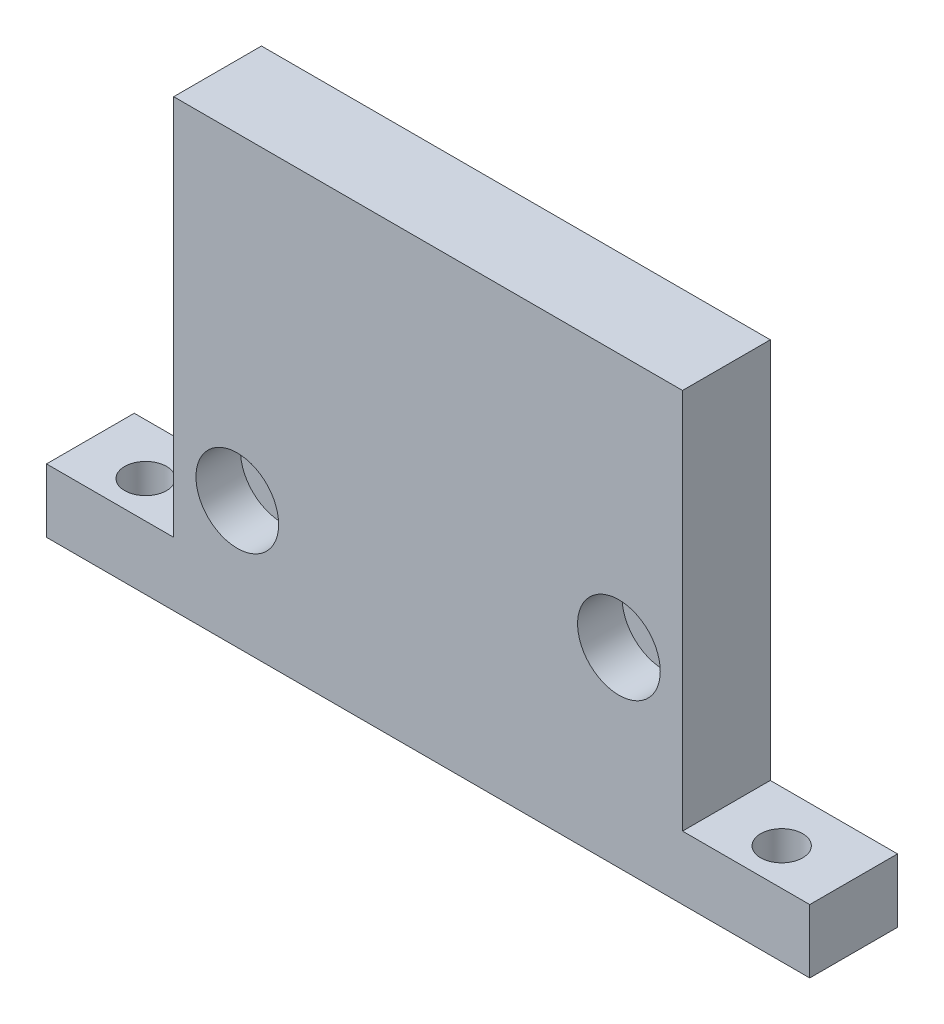
ISO-10303-21;
HEADER;
FILE_DESCRIPTION(('STEP AP214'),'2;1');
FILE_NAME('part.step','',(''),(''),'','','');
FILE_SCHEMA(('AUTOMOTIVE_DESIGN { 1 0 10303 214 1 1 1 1 }'));
ENDSEC;
DATA;
#1=APPLICATION_CONTEXT('core data for automotive mechanical design processes');
#2=APPLICATION_PROTOCOL_DEFINITION('international standard','automotive_design',2000,#1);
#3=PRODUCT_CONTEXT('',#1,'mechanical');
#4=PRODUCT('Part','Part','',(#3));
#5=PRODUCT_RELATED_PRODUCT_CATEGORY('part','',(#4));
#6=PRODUCT_DEFINITION_FORMATION('','',#4);
#7=PRODUCT_DEFINITION_CONTEXT('part definition',#1,'design');
#8=PRODUCT_DEFINITION('design','',#6,#7);
#9=PRODUCT_DEFINITION_SHAPE('','',#8);
#10=(LENGTH_UNIT() NAMED_UNIT(*) SI_UNIT(.MILLI.,.METRE.));
#11=(NAMED_UNIT(*) PLANE_ANGLE_UNIT() SI_UNIT($,.RADIAN.));
#12=(NAMED_UNIT(*) SI_UNIT($,.STERADIAN.) SOLID_ANGLE_UNIT());
#13=UNCERTAINTY_MEASURE_WITH_UNIT(LENGTH_MEASURE(1.E-05),#10,'distance_accuracy_value','');
#14=(GEOMETRIC_REPRESENTATION_CONTEXT(3) GLOBAL_UNCERTAINTY_ASSIGNED_CONTEXT((#13)) GLOBAL_UNIT_ASSIGNED_CONTEXT((#10,
#11,#12)) REPRESENTATION_CONTEXT('',''));
#15=CARTESIAN_POINT('',(0.,0.,0.));
#16=DIRECTION('',(0.,0.,1.));
#17=DIRECTION('',(1.,0.,0.));
#18=AXIS2_PLACEMENT_3D('',#15,#16,#17);
#19=CARTESIAN_POINT('',(-27.9708845876066,10.,20.4720510062712));
#20=DIRECTION('',(0.,0.,-1.));
#21=DIRECTION('',(-1.,0.,0.));
#22=AXIS2_PLACEMENT_3D('',#19,#20,#21);
#23=CYLINDRICAL_SURFACE('',#22,1.65);
#24=CARTESIAN_POINT('',(-27.9708845876066,10.,-4.52794899372876));
#25=DIRECTION('',(0.,0.,-1.));
#26=DIRECTION('',(-1.,0.,0.));
#27=AXIS2_PLACEMENT_3D('',#24,#25,#26);
#28=CIRCLE('',#27,1.65);
#29=CARTESIAN_POINT('',(-29.6208845876066,10.,-4.52794899372876));
#30=VERTEX_POINT('',#29);
#31=EDGE_CURVE('E279',#30,#30,#28,.T.);
#32=ORIENTED_EDGE('',*,*,#31,.T.);
#33=EDGE_LOOP('',(#32));
#34=FACE_BOUND('',#33,.T.);
#35=CARTESIAN_POINT('',(-27.9708845876066,10.,-1.12794899372876));
#36=DIRECTION('',(0.,0.,1.));
#37=DIRECTION('',(1.,0.,0.));
#38=AXIS2_PLACEMENT_3D('',#35,#36,#37);
#39=CIRCLE('',#38,1.65);
#40=CARTESIAN_POINT('',(-26.3208845876066,10.,-1.12794899372876));
#41=VERTEX_POINT('',#40);
#42=EDGE_CURVE('E283',#41,#41,#39,.F.);
#43=ORIENTED_EDGE('',*,*,#42,.F.);
#44=EDGE_LOOP('',(#43));
#45=FACE_BOUND('',#44,.T.);
#46=ADVANCED_FACE('F45',(#34,#45),#23,.F.);
#47=CARTESIAN_POINT('',(2.02911541239343,15.,20.4720510062712));
#48=DIRECTION('',(0.,0.,-1.));
#49=DIRECTION('',(-1.,0.,0.));
#50=AXIS2_PLACEMENT_3D('',#47,#48,#49);
#51=CYLINDRICAL_SURFACE('',#50,1.65);
#52=CARTESIAN_POINT('',(2.02911541239343,15.,-4.52794899372876));
#53=DIRECTION('',(0.,0.,-1.));
#54=DIRECTION('',(-1.,0.,0.));
#55=AXIS2_PLACEMENT_3D('',#52,#53,#54);
#56=CIRCLE('',#55,1.65);
#57=CARTESIAN_POINT('',(0.379115412393435,15.,-4.52794899372876));
#58=VERTEX_POINT('',#57);
#59=EDGE_CURVE('E191',#58,#58,#56,.T.);
#60=ORIENTED_EDGE('',*,*,#59,.T.);
#61=EDGE_LOOP('',(#60));
#62=FACE_BOUND('',#61,.T.);
#63=CARTESIAN_POINT('',(2.02911541239343,15.,-1.12794899372876));
#64=DIRECTION('',(0.,0.,1.));
#65=DIRECTION('',(1.,0.,0.));
#66=AXIS2_PLACEMENT_3D('',#63,#64,#65);
#67=CIRCLE('',#66,1.65);
#68=CARTESIAN_POINT('',(3.67911541239344,15.,-1.12794899372876));
#69=VERTEX_POINT('',#68);
#70=EDGE_CURVE('E270',#69,#69,#67,.F.);
#71=ORIENTED_EDGE('',*,*,#70,.F.);
#72=EDGE_LOOP('',(#71));
#73=FACE_BOUND('',#72,.T.);
#74=ADVANCED_FACE('F206',(#62,#73),#51,.F.);
#75=CARTESIAN_POINT('',(0.,5.,0.));
#76=DIRECTION('',(0.,1.,0.));
#77=DIRECTION('',(0.,0.,1.));
#78=AXIS2_PLACEMENT_3D('',#75,#76,#77);
#79=PLANE('',#78);
#80=CARTESIAN_POINT('',(11.9231033626032,5.,-0.527948993728763));
#81=DIRECTION('',(0.,1.,0.));
#82=DIRECTION('',(0.,0.,1.));
#83=AXIS2_PLACEMENT_3D('',#80,#81,#82);
#84=CIRCLE('',#83,1.65);
#85=CARTESIAN_POINT('',(11.9231033626032,5.,1.12205100627124));
#86=VERTEX_POINT('',#85);
#87=EDGE_CURVE('E147',#86,#86,#84,.T.);
#88=ORIENTED_EDGE('',*,*,#87,.F.);
#89=EDGE_LOOP('',(#88));
#90=FACE_BOUND('',#89,.T.);
#91=DIRECTION('',(-1.,0.,0.));
#92=VECTOR('',#91,1.);
#93=CARTESIAN_POINT('',(-42.9708845876065,5.,-4.52794899372876));
#94=LINE('',#93,#92);
#95=CARTESIAN_POINT('',(17.0291154123935,5.,-4.52794899372876));
#96=VERTEX_POINT('',#95);
#97=CARTESIAN_POINT('',(7.02911541239345,5.,-4.52794899372876));
#98=VERTEX_POINT('',#97);
#99=EDGE_CURVE('E68',#96,#98,#94,.T.);
#100=ORIENTED_EDGE('',*,*,#99,.T.);
#101=DIRECTION('',(0.,0.,1.));
#102=VECTOR('',#101,1.);
#103=CARTESIAN_POINT('',(7.02911541239345,5.,0.));
#104=LINE('',#103,#102);
#105=CARTESIAN_POINT('',(7.02911541239345,5.,2.37205100627124));
#106=VERTEX_POINT('',#105);
#107=EDGE_CURVE('E128',#98,#106,#104,.T.);
#108=ORIENTED_EDGE('',*,*,#107,.T.);
#109=DIRECTION('',(1.,0.,0.));
#110=VECTOR('',#109,1.);
#111=CARTESIAN_POINT('',(-42.9708845876065,5.,2.37205100627124));
#112=LINE('',#111,#110);
#113=CARTESIAN_POINT('',(17.0291154123935,5.,2.37205100627124));
#114=VERTEX_POINT('',#113);
#115=EDGE_CURVE('E154',#106,#114,#112,.T.);
#116=ORIENTED_EDGE('',*,*,#115,.T.);
#117=DIRECTION('',(0.,0.,-1.));
#118=VECTOR('',#117,1.);
#119=CARTESIAN_POINT('',(17.0291154123935,5.,-4.52794899372876));
#120=LINE('',#119,#118);
#121=EDGE_CURVE('E158',#114,#96,#120,.T.);
#122=ORIENTED_EDGE('',*,*,#121,.T.);
#123=EDGE_LOOP('',(#100,#108,#116,#122));
#124=FACE_BOUND('',#123,.T.);
#125=ADVANCED_FACE('F204',(#90,#124),#79,.T.);
#126=CARTESIAN_POINT('',(-42.9708845876065,5.,-4.52794899372876));
#127=DIRECTION('',(1.,0.,0.));
#128=DIRECTION('',(0.,0.,-1.));
#129=AXIS2_PLACEMENT_3D('',#126,#127,#128);
#130=PLANE('',#129);
#131=DIRECTION('',(0.,0.,1.));
#132=VECTOR('',#131,1.);
#133=CARTESIAN_POINT('',(-42.9708845876065,0.,-4.52794899372876));
#134=LINE('',#133,#132);
#135=CARTESIAN_POINT('',(-42.9708845876065,0.,-4.52794899372876));
#136=VERTEX_POINT('',#135);
#137=CARTESIAN_POINT('',(-42.9708845876065,0.,2.37205100627124));
#138=VERTEX_POINT('',#137);
#139=EDGE_CURVE('E150',#136,#138,#134,.T.);
#140=ORIENTED_EDGE('',*,*,#139,.T.);
#141=DIRECTION('',(0.,-1.,0.));
#142=VECTOR('',#141,1.);
#143=CARTESIAN_POINT('',(-42.9708845876065,5.,2.37205100627124));
#144=LINE('',#143,#142);
#145=CARTESIAN_POINT('',(-42.9708845876065,5.,2.37205100627124));
#146=VERTEX_POINT('',#145);
#147=EDGE_CURVE('E12',#146,#138,#144,.T.);
#148=ORIENTED_EDGE('',*,*,#147,.F.);
#149=DIRECTION('',(0.,0.,1.));
#150=VECTOR('',#149,1.);
#151=CARTESIAN_POINT('',(-42.9708845876065,5.,-4.52794899372876));
#152=LINE('',#151,#150);
#153=CARTESIAN_POINT('',(-42.9708845876065,5.,-4.52794899372876));
#154=VERTEX_POINT('',#153);
#155=EDGE_CURVE('E151',#154,#146,#152,.T.);
#156=ORIENTED_EDGE('',*,*,#155,.F.);
#157=DIRECTION('',(0.,-1.,0.));
#158=VECTOR('',#157,1.);
#159=CARTESIAN_POINT('',(-42.9708845876065,5.,-4.52794899372876));
#160=LINE('',#159,#158);
#161=EDGE_CURVE('E161',#154,#136,#160,.T.);
#162=ORIENTED_EDGE('',*,*,#161,.T.);
#163=EDGE_LOOP('',(#140,#148,#156,#162));
#164=FACE_BOUND('',#163,.T.);
#165=ADVANCED_FACE('F47',(#164),#130,.F.);
#166=CARTESIAN_POINT('',(-42.9708845876065,5.,2.37205100627124));
#167=DIRECTION('',(0.,0.,-1.));
#168=DIRECTION('',(-1.,0.,0.));
#169=AXIS2_PLACEMENT_3D('',#166,#167,#168);
#170=PLANE('',#169);
#171=CARTESIAN_POINT('',(-27.9708845876066,10.,2.37205100627124));
#172=DIRECTION('',(0.,0.,1.));
#173=DIRECTION('',(1.,0.,0.));
#174=AXIS2_PLACEMENT_3D('',#171,#172,#173);
#175=CIRCLE('',#174,3.25);
#176=CARTESIAN_POINT('',(-24.7208845876066,10.,2.37205100627124));
#177=VERTEX_POINT('',#176);
#178=EDGE_CURVE('E265',#177,#177,#175,.T.);
#179=ORIENTED_EDGE('',*,*,#178,.F.);
#180=EDGE_LOOP('',(#179));
#181=FACE_BOUND('',#180,.T.);
#182=CARTESIAN_POINT('',(2.02911541239343,15.,2.37205100627124));
#183=DIRECTION('',(0.,0.,1.));
#184=DIRECTION('',(1.,0.,0.));
#185=AXIS2_PLACEMENT_3D('',#182,#183,#184);
#186=CIRCLE('',#185,3.25);
#187=CARTESIAN_POINT('',(5.27911541239343,15.,2.37205100627124));
#188=VERTEX_POINT('',#187);
#189=EDGE_CURVE('E268',#188,#188,#186,.T.);
#190=ORIENTED_EDGE('',*,*,#189,.F.);
#191=EDGE_LOOP('',(#190));
#192=FACE_BOUND('',#191,.T.);
#193=DIRECTION('',(1.,0.,0.));
#194=VECTOR('',#193,1.);
#195=CARTESIAN_POINT('',(-42.9708845876065,0.,2.37205100627124));
#196=LINE('',#195,#194);
#197=CARTESIAN_POINT('',(17.0291154123935,0.,2.37205100627124));
#198=VERTEX_POINT('',#197);
#199=EDGE_CURVE('E164',#138,#198,#196,.T.);
#200=ORIENTED_EDGE('',*,*,#199,.T.);
#201=DIRECTION('',(0.,-1.,0.));
#202=VECTOR('',#201,1.);
#203=CARTESIAN_POINT('',(17.0291154123935,5.,2.37205100627124));
#204=LINE('',#203,#202);
#205=EDGE_CURVE('E53',#114,#198,#204,.T.);
#206=ORIENTED_EDGE('',*,*,#205,.F.);
#207=ORIENTED_EDGE('',*,*,#115,.F.);
#208=DIRECTION('',(0.,-1.,0.));
#209=VECTOR('',#208,1.);
#210=CARTESIAN_POINT('',(7.02911541239345,35.,2.37205100627124));
#211=LINE('',#210,#209);
#212=CARTESIAN_POINT('',(7.02911541239345,35.,2.37205100627124));
#213=VERTEX_POINT('',#212);
#214=EDGE_CURVE('E138',#213,#106,#211,.T.);
#215=ORIENTED_EDGE('',*,*,#214,.F.);
#216=DIRECTION('',(1.,0.,0.));
#217=VECTOR('',#216,1.);
#218=CARTESIAN_POINT('',(0.,35.,2.37205100627124));
#219=LINE('',#218,#217);
#220=CARTESIAN_POINT('',(-32.9708845876065,35.,2.37205100627124));
#221=VERTEX_POINT('',#220);
#222=EDGE_CURVE('E119',#221,#213,#219,.T.);
#223=ORIENTED_EDGE('',*,*,#222,.F.);
#224=DIRECTION('',(0.,-1.,0.));
#225=VECTOR('',#224,1.);
#226=CARTESIAN_POINT('',(-32.9708845876065,35.,2.37205100627124));
#227=LINE('',#226,#225);
#228=CARTESIAN_POINT('',(-32.9708845876065,5.,2.37205100627124));
#229=VERTEX_POINT('',#228);
#230=EDGE_CURVE('E116',#221,#229,#227,.T.);
#231=ORIENTED_EDGE('',*,*,#230,.T.);
#232=EDGE_CURVE('E156',#146,#229,#112,.T.);
#233=ORIENTED_EDGE('',*,*,#232,.F.);
#234=ORIENTED_EDGE('',*,*,#147,.T.);
#235=EDGE_LOOP('',(#200,#206,#207,#215,#223,#231,#233,#234));
#236=FACE_BOUND('',#235,.T.);
#237=ADVANCED_FACE('F193',(#181,#192,#236),#170,.F.);
#238=CARTESIAN_POINT('',(17.0291154123935,5.,-4.52794899372876));
#239=DIRECTION('',(-1.,0.,0.));
#240=DIRECTION('',(0.,0.,1.));
#241=AXIS2_PLACEMENT_3D('',#238,#239,#240);
#242=PLANE('',#241);
#243=DIRECTION('',(0.,0.,-1.));
#244=VECTOR('',#243,1.);
#245=CARTESIAN_POINT('',(17.0291154123935,0.,-4.52794899372876));
#246=LINE('',#245,#244);
#247=CARTESIAN_POINT('',(17.0291154123935,0.,-4.52794899372876));
#248=VERTEX_POINT('',#247);
#249=EDGE_CURVE('E166',#198,#248,#246,.T.);
#250=ORIENTED_EDGE('',*,*,#249,.T.);
#251=DIRECTION('',(0.,-1.,0.));
#252=VECTOR('',#251,1.);
#253=CARTESIAN_POINT('',(17.0291154123935,5.,-4.52794899372876));
#254=LINE('',#253,#252);
#255=EDGE_CURVE('E171',#96,#248,#254,.T.);
#256=ORIENTED_EDGE('',*,*,#255,.F.);
#257=ORIENTED_EDGE('',*,*,#121,.F.);
#258=ORIENTED_EDGE('',*,*,#205,.T.);
#259=EDGE_LOOP('',(#250,#256,#257,#258));
#260=FACE_BOUND('',#259,.T.);
#261=ADVANCED_FACE('F178',(#260),#242,.F.);
#262=CARTESIAN_POINT('',(-42.9708845876065,5.,-4.52794899372876));
#263=DIRECTION('',(0.,0.,1.));
#264=DIRECTION('',(1.,0.,0.));
#265=AXIS2_PLACEMENT_3D('',#262,#263,#264);
#266=PLANE('',#265);
#267=ORIENTED_EDGE('',*,*,#59,.F.);
#268=EDGE_LOOP('',(#267));
#269=FACE_BOUND('',#268,.T.);
#270=ORIENTED_EDGE('',*,*,#31,.F.);
#271=EDGE_LOOP('',(#270));
#272=FACE_BOUND('',#271,.T.);
#273=DIRECTION('',(-1.,0.,0.));
#274=VECTOR('',#273,1.);
#275=CARTESIAN_POINT('',(-42.9708845876065,0.,-4.52794899372876));
#276=LINE('',#275,#274);
#277=EDGE_CURVE('E155',#248,#136,#276,.T.);
#278=ORIENTED_EDGE('',*,*,#277,.T.);
#279=ORIENTED_EDGE('',*,*,#161,.F.);
#280=CARTESIAN_POINT('',(-32.9708845876065,5.,-4.52794899372876));
#281=VERTEX_POINT('',#280);
#282=EDGE_CURVE('E132',#281,#154,#94,.T.);
#283=ORIENTED_EDGE('',*,*,#282,.F.);
#284=DIRECTION('',(0.,-1.,0.));
#285=VECTOR('',#284,1.);
#286=CARTESIAN_POINT('',(-32.9708845876065,35.,-4.52794899372876));
#287=LINE('',#286,#285);
#288=CARTESIAN_POINT('',(-32.9708845876065,35.,-4.52794899372876));
#289=VERTEX_POINT('',#288);
#290=EDGE_CURVE('E114',#289,#281,#287,.T.);
#291=ORIENTED_EDGE('',*,*,#290,.F.);
#292=DIRECTION('',(-1.,0.,0.));
#293=VECTOR('',#292,1.);
#294=CARTESIAN_POINT('',(0.,35.,-4.52794899372876));
#295=LINE('',#294,#293);
#296=CARTESIAN_POINT('',(7.02911541239345,35.,-4.52794899372876));
#297=VERTEX_POINT('',#296);
#298=EDGE_CURVE('E120',#297,#289,#295,.T.);
#299=ORIENTED_EDGE('',*,*,#298,.F.);
#300=DIRECTION('',(0.,-1.,0.));
#301=VECTOR('',#300,1.);
#302=CARTESIAN_POINT('',(7.02911541239345,35.,-4.52794899372876));
#303=LINE('',#302,#301);
#304=EDGE_CURVE('E197',#297,#98,#303,.T.);
#305=ORIENTED_EDGE('',*,*,#304,.T.);
#306=ORIENTED_EDGE('',*,*,#99,.F.);
#307=ORIENTED_EDGE('',*,*,#255,.T.);
#308=EDGE_LOOP('',(#278,#279,#283,#291,#299,#305,#306,#307));
#309=FACE_BOUND('',#308,.T.);
#310=ADVANCED_FACE('F130',(#269,#272,#309),#266,.F.);
#311=DIRECTION('',(0.,0.,1.));
#312=VECTOR('',#311,1.);
#313=CARTESIAN_POINT('',(-32.9708845876065,5.,0.));
#314=LINE('',#313,#312);
#315=EDGE_CURVE('E60',#281,#229,#314,.T.);
#316=ORIENTED_EDGE('',*,*,#315,.F.);
#317=ORIENTED_EDGE('',*,*,#282,.T.);
#318=ORIENTED_EDGE('',*,*,#155,.T.);
#319=ORIENTED_EDGE('',*,*,#232,.T.);
#320=EDGE_LOOP('',(#316,#317,#318,#319));
#321=FACE_BOUND('',#320,.T.);
#322=CARTESIAN_POINT('',(-38.0768966373968,5.,-0.527948993728763));
#323=DIRECTION('',(0.,1.,0.));
#324=DIRECTION('',(0.,0.,1.));
#325=AXIS2_PLACEMENT_3D('',#322,#323,#324);
#326=CIRCLE('',#325,1.65);
#327=CARTESIAN_POINT('',(-38.0768966373968,5.,1.12205100627124));
#328=VERTEX_POINT('',#327);
#329=EDGE_CURVE('E143',#328,#328,#326,.T.);
#330=ORIENTED_EDGE('',*,*,#329,.F.);
#331=EDGE_LOOP('',(#330));
#332=FACE_BOUND('',#331,.T.);
#333=ADVANCED_FACE('F189',(#321,#332),#79,.T.);
#334=CARTESIAN_POINT('',(0.,0.,0.));
#335=DIRECTION('',(0.,1.,0.));
#336=DIRECTION('',(0.,0.,1.));
#337=AXIS2_PLACEMENT_3D('',#334,#335,#336);
#338=PLANE('',#337);
#339=CARTESIAN_POINT('',(11.9231033626032,0.,-0.527948993728763));
#340=DIRECTION('',(0.,-1.,0.));
#341=DIRECTION('',(0.,0.,-1.));
#342=AXIS2_PLACEMENT_3D('',#339,#340,#341);
#343=CIRCLE('',#342,1.65);
#344=CARTESIAN_POINT('',(11.9231033626032,0.,-2.17794899372876));
#345=VERTEX_POINT('',#344);
#346=EDGE_CURVE('E136',#345,#345,#343,.T.);
#347=ORIENTED_EDGE('',*,*,#346,.F.);
#348=EDGE_LOOP('',(#347));
#349=FACE_BOUND('',#348,.T.);
#350=CARTESIAN_POINT('',(-38.0768966373968,0.,-0.527948993728763));
#351=DIRECTION('',(0.,-1.,0.));
#352=DIRECTION('',(0.,0.,-1.));
#353=AXIS2_PLACEMENT_3D('',#350,#351,#352);
#354=CIRCLE('',#353,1.65);
#355=CARTESIAN_POINT('',(-38.0768966373968,0.,-2.17794899372876));
#356=VERTEX_POINT('',#355);
#357=EDGE_CURVE('E133',#356,#356,#354,.T.);
#358=ORIENTED_EDGE('',*,*,#357,.F.);
#359=EDGE_LOOP('',(#358));
#360=FACE_BOUND('',#359,.T.);
#361=ORIENTED_EDGE('',*,*,#139,.F.);
#362=ORIENTED_EDGE('',*,*,#277,.F.);
#363=ORIENTED_EDGE('',*,*,#249,.F.);
#364=ORIENTED_EDGE('',*,*,#199,.F.);
#365=EDGE_LOOP('',(#361,#362,#363,#364));
#366=FACE_BOUND('',#365,.T.);
#367=ADVANCED_FACE('F185',(#349,#360,#366),#338,.F.);
#368=CARTESIAN_POINT('',(-38.0768966373968,10.,-0.527948993728763));
#369=DIRECTION('',(0.,-1.,0.));
#370=DIRECTION('',(0.,0.,-1.));
#371=AXIS2_PLACEMENT_3D('',#368,#369,#370);
#372=CYLINDRICAL_SURFACE('',#371,1.65);
#373=ORIENTED_EDGE('',*,*,#329,.T.);
#374=EDGE_LOOP('',(#373));
#375=FACE_BOUND('',#374,.T.);
#376=ORIENTED_EDGE('',*,*,#357,.T.);
#377=EDGE_LOOP('',(#376));
#378=FACE_BOUND('',#377,.T.);
#379=ADVANCED_FACE('F238',(#375,#378),#372,.F.);
#380=CARTESIAN_POINT('',(11.9231033626032,10.,-0.527948993728763));
#381=DIRECTION('',(0.,-1.,0.));
#382=DIRECTION('',(0.,0.,-1.));
#383=AXIS2_PLACEMENT_3D('',#380,#381,#382);
#384=CYLINDRICAL_SURFACE('',#383,1.65);
#385=ORIENTED_EDGE('',*,*,#87,.T.);
#386=EDGE_LOOP('',(#385));
#387=FACE_BOUND('',#386,.T.);
#388=ORIENTED_EDGE('',*,*,#346,.T.);
#389=EDGE_LOOP('',(#388));
#390=FACE_BOUND('',#389,.T.);
#391=ADVANCED_FACE('F237',(#387,#390),#384,.F.);
#392=CARTESIAN_POINT('',(-32.9708845876065,35.,0.));
#393=DIRECTION('',(1.,0.,0.));
#394=DIRECTION('',(0.,0.,-1.));
#395=AXIS2_PLACEMENT_3D('',#392,#393,#394);
#396=PLANE('',#395);
#397=ORIENTED_EDGE('',*,*,#315,.T.);
#398=ORIENTED_EDGE('',*,*,#230,.F.);
#399=DIRECTION('',(0.,0.,1.));
#400=VECTOR('',#399,1.);
#401=CARTESIAN_POINT('',(-32.9708845876065,35.,0.));
#402=LINE('',#401,#400);
#403=EDGE_CURVE('E110',#289,#221,#402,.T.);
#404=ORIENTED_EDGE('',*,*,#403,.F.);
#405=ORIENTED_EDGE('',*,*,#290,.T.);
#406=EDGE_LOOP('',(#397,#398,#404,#405));
#407=FACE_BOUND('',#406,.T.);
#408=ADVANCED_FACE('F112',(#407),#396,.F.);
#409=CARTESIAN_POINT('',(7.02911541239345,35.,0.));
#410=DIRECTION('',(1.,0.,0.));
#411=DIRECTION('',(0.,0.,-1.));
#412=AXIS2_PLACEMENT_3D('',#409,#410,#411);
#413=PLANE('',#412);
#414=ORIENTED_EDGE('',*,*,#107,.F.);
#415=ORIENTED_EDGE('',*,*,#304,.F.);
#416=DIRECTION('',(0.,0.,1.));
#417=VECTOR('',#416,1.);
#418=CARTESIAN_POINT('',(7.02911541239345,35.,0.));
#419=LINE('',#418,#417);
#420=EDGE_CURVE('E126',#297,#213,#419,.T.);
#421=ORIENTED_EDGE('',*,*,#420,.T.);
#422=ORIENTED_EDGE('',*,*,#214,.T.);
#423=EDGE_LOOP('',(#414,#415,#421,#422));
#424=FACE_BOUND('',#423,.T.);
#425=ADVANCED_FACE('F203',(#424),#413,.T.);
#426=CARTESIAN_POINT('',(0.,35.,0.));
#427=DIRECTION('',(0.,1.,0.));
#428=DIRECTION('',(0.,0.,1.));
#429=AXIS2_PLACEMENT_3D('',#426,#427,#428);
#430=PLANE('',#429);
#431=ORIENTED_EDGE('',*,*,#298,.T.);
#432=ORIENTED_EDGE('',*,*,#403,.T.);
#433=ORIENTED_EDGE('',*,*,#222,.T.);
#434=ORIENTED_EDGE('',*,*,#420,.F.);
#435=EDGE_LOOP('',(#431,#432,#433,#434));
#436=FACE_BOUND('',#435,.T.);
#437=ADVANCED_FACE('F124',(#436),#430,.T.);
#438=CARTESIAN_POINT('',(2.02911541239343,15.,-1.12794899372876));
#439=DIRECTION('',(0.,0.,1.));
#440=DIRECTION('',(1.,0.,0.));
#441=AXIS2_PLACEMENT_3D('',#438,#439,#440);
#442=CYLINDRICAL_SURFACE('',#441,3.25);
#443=CARTESIAN_POINT('',(2.02911541239343,15.,-1.12794899372876));
#444=DIRECTION('',(0.,0.,1.));
#445=DIRECTION('',(1.,0.,0.));
#446=AXIS2_PLACEMENT_3D('',#443,#444,#445);
#447=CIRCLE('',#446,3.25);
#448=CARTESIAN_POINT('',(5.27911541239343,15.,-1.12794899372876));
#449=VERTEX_POINT('',#448);
#450=EDGE_CURVE('E273',#449,#449,#447,.T.);
#451=ORIENTED_EDGE('',*,*,#450,.F.);
#452=EDGE_LOOP('',(#451));
#453=FACE_BOUND('',#452,.T.);
#454=ORIENTED_EDGE('',*,*,#189,.T.);
#455=EDGE_LOOP('',(#454));
#456=FACE_BOUND('',#455,.T.);
#457=ADVANCED_FACE('F232',(#453,#456),#442,.F.);
#458=CARTESIAN_POINT('',(0.,0.,-1.12794899372876));
#459=DIRECTION('',(0.,0.,1.));
#460=DIRECTION('',(1.,0.,0.));
#461=AXIS2_PLACEMENT_3D('',#458,#459,#460);
#462=PLANE('',#461);
#463=ORIENTED_EDGE('',*,*,#70,.T.);
#464=EDGE_LOOP('',(#463));
#465=FACE_BOUND('',#464,.T.);
#466=ORIENTED_EDGE('',*,*,#450,.T.);
#467=EDGE_LOOP('',(#466));
#468=FACE_BOUND('',#467,.T.);
#469=ADVANCED_FACE('F294',(#465,#468),#462,.T.);
#470=CARTESIAN_POINT('',(-27.9708845876066,10.,-1.12794899372876));
#471=DIRECTION('',(0.,0.,1.));
#472=DIRECTION('',(1.,0.,0.));
#473=AXIS2_PLACEMENT_3D('',#470,#471,#472);
#474=CYLINDRICAL_SURFACE('',#473,3.25);
#475=CARTESIAN_POINT('',(-27.9708845876066,10.,-1.12794899372876));
#476=DIRECTION('',(0.,0.,1.));
#477=DIRECTION('',(1.,0.,0.));
#478=AXIS2_PLACEMENT_3D('',#475,#476,#477);
#479=CIRCLE('',#478,3.25);
#480=CARTESIAN_POINT('',(-24.7208845876066,10.,-1.12794899372876));
#481=VERTEX_POINT('',#480);
#482=EDGE_CURVE('E280',#481,#481,#479,.T.);
#483=ORIENTED_EDGE('',*,*,#482,.F.);
#484=EDGE_LOOP('',(#483));
#485=FACE_BOUND('',#484,.T.);
#486=ORIENTED_EDGE('',*,*,#178,.T.);
#487=EDGE_LOOP('',(#486));
#488=FACE_BOUND('',#487,.T.);
#489=ADVANCED_FACE('F299',(#485,#488),#474,.F.);
#490=CARTESIAN_POINT('',(0.,0.,-1.12794899372876));
#491=DIRECTION('',(0.,0.,1.));
#492=DIRECTION('',(1.,0.,0.));
#493=AXIS2_PLACEMENT_3D('',#490,#491,#492);
#494=PLANE('',#493);
#495=ORIENTED_EDGE('',*,*,#42,.T.);
#496=EDGE_LOOP('',(#495));
#497=FACE_BOUND('',#496,.T.);
#498=ORIENTED_EDGE('',*,*,#482,.T.);
#499=EDGE_LOOP('',(#498));
#500=FACE_BOUND('',#499,.T.);
#501=ADVANCED_FACE('F305',(#497,#500),#494,.T.);
#502=CLOSED_SHELL('',(#46,#74,#125,#165,#237,#261,#310,#333,#367,#379,#391,#408,#425,#437,#457,
#469,#489,#501));
#503=MANIFOLD_SOLID_BREP('B2',#502);
#504=ADVANCED_BREP_SHAPE_REPRESENTATION('',(#18,#503),#14);
#505=SHAPE_DEFINITION_REPRESENTATION(#9,#504);
ENDSEC;
END-ISO-10303-21;
